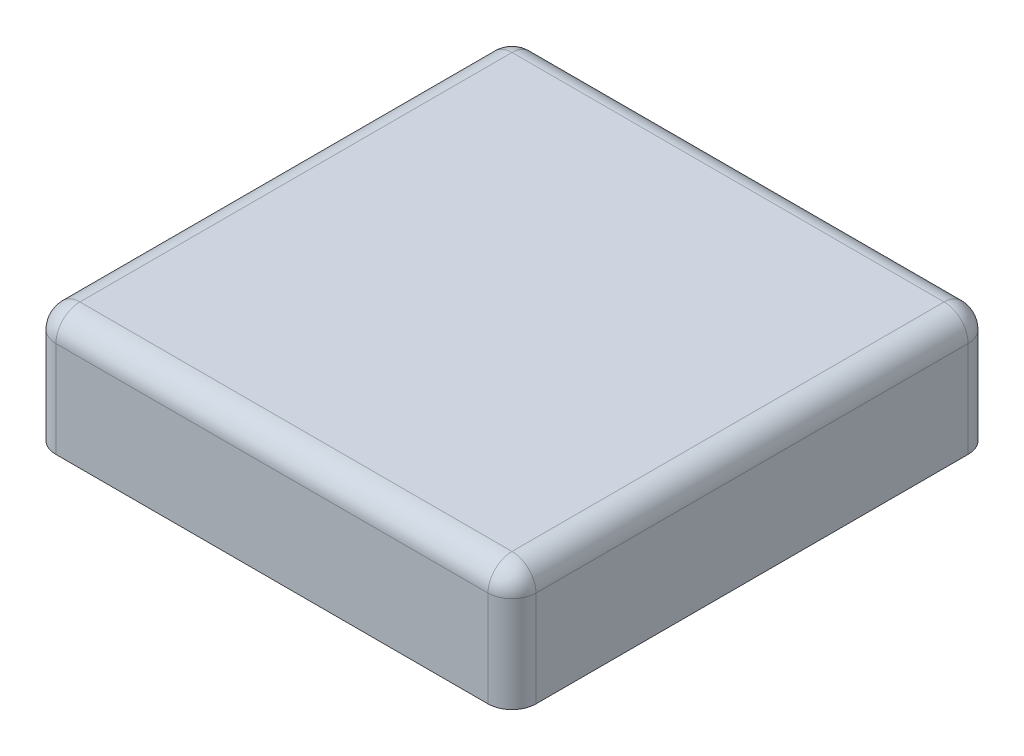
ISO-10303-21;
HEADER;
FILE_DESCRIPTION(('STEP AP214'),'2;1');
FILE_NAME('part.step','',(''),(''),'','','');
FILE_SCHEMA(('AUTOMOTIVE_DESIGN { 1 0 10303 214 1 1 1 1 }'));
ENDSEC;
DATA;
#1=APPLICATION_CONTEXT('core data for automotive mechanical design processes');
#2=APPLICATION_PROTOCOL_DEFINITION('international standard','automotive_design',2000,#1);
#3=PRODUCT_CONTEXT('',#1,'mechanical');
#4=PRODUCT('Part','Part','',(#3));
#5=PRODUCT_RELATED_PRODUCT_CATEGORY('part','',(#4));
#6=PRODUCT_DEFINITION_FORMATION('','',#4);
#7=PRODUCT_DEFINITION_CONTEXT('part definition',#1,'design');
#8=PRODUCT_DEFINITION('design','',#6,#7);
#9=PRODUCT_DEFINITION_SHAPE('','',#8);
#10=(LENGTH_UNIT() NAMED_UNIT(*) SI_UNIT(.MILLI.,.METRE.));
#11=(NAMED_UNIT(*) PLANE_ANGLE_UNIT() SI_UNIT($,.RADIAN.));
#12=(NAMED_UNIT(*) SI_UNIT($,.STERADIAN.) SOLID_ANGLE_UNIT());
#13=UNCERTAINTY_MEASURE_WITH_UNIT(LENGTH_MEASURE(1.E-05),#10,'distance_accuracy_value','');
#14=(GEOMETRIC_REPRESENTATION_CONTEXT(3) GLOBAL_UNCERTAINTY_ASSIGNED_CONTEXT((#13)) GLOBAL_UNIT_ASSIGNED_CONTEXT((#10,
#11,#12)) REPRESENTATION_CONTEXT('',''));
#15=CARTESIAN_POINT('',(0.,0.,0.));
#16=DIRECTION('',(0.,0.,1.));
#17=DIRECTION('',(1.,0.,0.));
#18=AXIS2_PLACEMENT_3D('',#15,#16,#17);
#19=CARTESIAN_POINT('',(0.,0.,0.));
#20=DIRECTION('',(0.,-1.,0.));
#21=DIRECTION('',(0.,0.,-1.));
#22=AXIS2_PLACEMENT_3D('',#19,#20,#21);
#23=PLANE('',#22);
#24=DIRECTION('',(-1.,0.,0.));
#25=VECTOR('',#24,1.);
#26=CARTESIAN_POINT('',(-3.00000000000002,0.,-3.00000000000002));
#27=LINE('',#26,#25);
#28=CARTESIAN_POINT('',(2.69999999999998,0.,-3.00000000000002));
#29=VERTEX_POINT('',#28);
#30=CARTESIAN_POINT('',(-2.70000000000002,0.,-3.00000000000002));
#31=VERTEX_POINT('',#30);
#32=EDGE_CURVE('E189',#29,#31,#27,.T.);
#33=ORIENTED_EDGE('',*,*,#32,.F.);
#34=CARTESIAN_POINT('',(2.69999999999998,0.,-2.70000000000002));
#35=DIRECTION('',(0.,-1.,0.));
#36=DIRECTION('',(0.,0.,-1.));
#37=AXIS2_PLACEMENT_3D('',#34,#35,#36);
#38=CIRCLE('',#37,0.3);
#39=CARTESIAN_POINT('',(2.99999999999998,0.,-2.70000000000002));
#40=VERTEX_POINT('',#39);
#41=EDGE_CURVE('E211',#29,#40,#38,.T.);
#42=ORIENTED_EDGE('',*,*,#41,.T.);
#43=DIRECTION('',(0.,0.,-1.));
#44=VECTOR('',#43,1.);
#45=CARTESIAN_POINT('',(2.99999999999998,0.,2.99999999999999));
#46=LINE('',#45,#44);
#47=CARTESIAN_POINT('',(2.99999999999998,0.,2.69999999999999));
#48=VERTEX_POINT('',#47);
#49=EDGE_CURVE('E186',#48,#40,#46,.T.);
#50=ORIENTED_EDGE('',*,*,#49,.F.);
#51=CARTESIAN_POINT('',(2.69999999999998,0.,2.69999999999999));
#52=DIRECTION('',(0.,-1.,0.));
#53=DIRECTION('',(0.,0.,-1.));
#54=AXIS2_PLACEMENT_3D('',#51,#52,#53);
#55=CIRCLE('',#54,0.3);
#56=CARTESIAN_POINT('',(2.69999999999998,0.,2.99999999999999));
#57=VERTEX_POINT('',#56);
#58=EDGE_CURVE('E209',#48,#57,#55,.T.);
#59=ORIENTED_EDGE('',*,*,#58,.T.);
#60=DIRECTION('',(1.,0.,0.));
#61=VECTOR('',#60,1.);
#62=CARTESIAN_POINT('',(-3.00000000000002,0.,2.99999999999999));
#63=LINE('',#62,#61);
#64=CARTESIAN_POINT('',(-2.70000000000002,0.,2.99999999999999));
#65=VERTEX_POINT('',#64);
#66=EDGE_CURVE('E195',#65,#57,#63,.T.);
#67=ORIENTED_EDGE('',*,*,#66,.F.);
#68=CARTESIAN_POINT('',(-2.70000000000002,0.,2.69999999999999));
#69=DIRECTION('',(0.,-1.,0.));
#70=DIRECTION('',(0.,0.,-1.));
#71=AXIS2_PLACEMENT_3D('',#68,#69,#70);
#72=CIRCLE('',#71,0.3);
#73=CARTESIAN_POINT('',(-3.00000000000002,0.,2.69999999999999));
#74=VERTEX_POINT('',#73);
#75=EDGE_CURVE('E205',#65,#74,#72,.T.);
#76=ORIENTED_EDGE('',*,*,#75,.T.);
#77=DIRECTION('',(0.,0.,1.));
#78=VECTOR('',#77,1.);
#79=CARTESIAN_POINT('',(-3.00000000000002,0.,2.99999999999999));
#80=LINE('',#79,#78);
#81=CARTESIAN_POINT('',(-3.00000000000002,0.,-2.70000000000002));
#82=VERTEX_POINT('',#81);
#83=EDGE_CURVE('E192',#82,#74,#80,.T.);
#84=ORIENTED_EDGE('',*,*,#83,.F.);
#85=CARTESIAN_POINT('',(-2.70000000000002,0.,-2.70000000000002));
#86=DIRECTION('',(0.,-1.,0.));
#87=DIRECTION('',(0.,0.,-1.));
#88=AXIS2_PLACEMENT_3D('',#85,#86,#87);
#89=CIRCLE('',#88,0.3);
#90=EDGE_CURVE('E207',#82,#31,#89,.T.);
#91=ORIENTED_EDGE('',*,*,#90,.T.);
#92=EDGE_LOOP('',(#33,#42,#50,#59,#67,#76,#84,#91));
#93=FACE_BOUND('',#92,.T.);
#94=DIRECTION('',(0.,0.,-1.));
#95=VECTOR('',#94,1.);
#96=CARTESIAN_POINT('',(2.69999999999998,0.,0.));
#97=LINE('',#96,#95);
#98=CARTESIAN_POINT('',(2.69999999999998,0.,2.69999999999999));
#99=VERTEX_POINT('',#98);
#100=CARTESIAN_POINT('',(2.69999999999998,0.,-2.70000000000002));
#101=VERTEX_POINT('',#100);
#102=EDGE_CURVE('E181',#99,#101,#97,.T.);
#103=ORIENTED_EDGE('',*,*,#102,.T.);
#104=DIRECTION('',(-1.,0.,0.));
#105=VECTOR('',#104,1.);
#106=CARTESIAN_POINT('',(0.,0.,-2.70000000000002));
#107=LINE('',#106,#105);
#108=CARTESIAN_POINT('',(-2.70000000000002,0.,-2.70000000000002));
#109=VERTEX_POINT('',#108);
#110=EDGE_CURVE('E162',#101,#109,#107,.T.);
#111=ORIENTED_EDGE('',*,*,#110,.T.);
#112=DIRECTION('',(0.,0.,1.));
#113=VECTOR('',#112,1.);
#114=CARTESIAN_POINT('',(-2.70000000000002,0.,0.));
#115=LINE('',#114,#113);
#116=CARTESIAN_POINT('',(-2.70000000000002,0.,2.69999999999999));
#117=VERTEX_POINT('',#116);
#118=EDGE_CURVE('E172',#109,#117,#115,.T.);
#119=ORIENTED_EDGE('',*,*,#118,.T.);
#120=DIRECTION('',(1.,0.,0.));
#121=VECTOR('',#120,1.);
#122=CARTESIAN_POINT('',(0.,0.,2.69999999999999));
#123=LINE('',#122,#121);
#124=EDGE_CURVE('E60',#117,#99,#123,.T.);
#125=ORIENTED_EDGE('',*,*,#124,.T.);
#126=EDGE_LOOP('',(#103,#111,#119,#125));
#127=FACE_BOUND('',#126,.T.);
#128=ADVANCED_FACE('F43',(#93,#127),#23,.T.);
#129=CARTESIAN_POINT('',(2.99999999999998,1.5,2.99999999999999));
#130=DIRECTION('',(-1.,0.,0.));
#131=DIRECTION('',(0.,0.,1.));
#132=AXIS2_PLACEMENT_3D('',#129,#130,#131);
#133=PLANE('',#132);
#134=ORIENTED_EDGE('',*,*,#49,.T.);
#135=DIRECTION('',(0.,-1.,0.));
#136=VECTOR('',#135,1.);
#137=CARTESIAN_POINT('',(2.99999999999998,1.5,-2.70000000000002));
#138=LINE('',#137,#136);
#139=CARTESIAN_POINT('',(2.99999999999998,1.2,-2.70000000000002));
#140=VERTEX_POINT('',#139);
#141=EDGE_CURVE('E217',#40,#140,#138,.F.);
#142=ORIENTED_EDGE('',*,*,#141,.T.);
#143=DIRECTION('',(0.,0.,-1.));
#144=VECTOR('',#143,1.);
#145=CARTESIAN_POINT('',(2.99999999999998,1.2,2.99999999999999));
#146=LINE('',#145,#144);
#147=CARTESIAN_POINT('',(2.99999999999998,1.2,2.69999999999999));
#148=VERTEX_POINT('',#147);
#149=EDGE_CURVE('E213',#140,#148,#146,.F.);
#150=ORIENTED_EDGE('',*,*,#149,.T.);
#151=DIRECTION('',(0.,-1.,0.));
#152=VECTOR('',#151,1.);
#153=CARTESIAN_POINT('',(2.99999999999998,1.5,2.69999999999999));
#154=LINE('',#153,#152);
#155=EDGE_CURVE('E215',#148,#48,#154,.T.);
#156=ORIENTED_EDGE('',*,*,#155,.T.);
#157=EDGE_LOOP('',(#134,#142,#150,#156));
#158=FACE_BOUND('',#157,.T.);
#159=ADVANCED_FACE('F323',(#158),#133,.F.);
#160=CARTESIAN_POINT('',(-3.00000000000002,1.5,-3.00000000000002));
#161=DIRECTION('',(0.,0.,1.));
#162=DIRECTION('',(1.,0.,0.));
#163=AXIS2_PLACEMENT_3D('',#160,#161,#162);
#164=PLANE('',#163);
#165=DIRECTION('',(-1.,0.,0.));
#166=VECTOR('',#165,1.);
#167=CARTESIAN_POINT('',(-3.00000000000002,1.2,-3.00000000000002));
#168=LINE('',#167,#166);
#169=CARTESIAN_POINT('',(-2.70000000000002,1.2,-3.00000000000002));
#170=VERTEX_POINT('',#169);
#171=CARTESIAN_POINT('',(2.69999999999998,1.2,-3.00000000000002));
#172=VERTEX_POINT('',#171);
#173=EDGE_CURVE('E198',#170,#172,#168,.F.);
#174=ORIENTED_EDGE('',*,*,#173,.T.);
#175=DIRECTION('',(0.,-1.,0.));
#176=VECTOR('',#175,1.);
#177=CARTESIAN_POINT('',(2.69999999999998,1.5,-3.00000000000002));
#178=LINE('',#177,#176);
#179=EDGE_CURVE('E202',#172,#29,#178,.T.);
#180=ORIENTED_EDGE('',*,*,#179,.T.);
#181=ORIENTED_EDGE('',*,*,#32,.T.);
#182=DIRECTION('',(0.,-1.,0.));
#183=VECTOR('',#182,1.);
#184=CARTESIAN_POINT('',(-2.70000000000002,1.5,-3.00000000000002));
#185=LINE('',#184,#183);
#186=EDGE_CURVE('E200',#31,#170,#185,.F.);
#187=ORIENTED_EDGE('',*,*,#186,.T.);
#188=EDGE_LOOP('',(#174,#180,#181,#187));
#189=FACE_BOUND('',#188,.T.);
#190=ADVANCED_FACE('F314',(#189),#164,.F.);
#191=CARTESIAN_POINT('',(-3.00000000000002,1.5,2.99999999999999));
#192=DIRECTION('',(1.,0.,0.));
#193=DIRECTION('',(0.,0.,-1.));
#194=AXIS2_PLACEMENT_3D('',#191,#192,#193);
#195=PLANE('',#194);
#196=DIRECTION('',(0.,0.,1.));
#197=VECTOR('',#196,1.);
#198=CARTESIAN_POINT('',(-3.00000000000002,1.2,2.99999999999999));
#199=LINE('',#198,#197);
#200=CARTESIAN_POINT('',(-3.00000000000002,1.2,2.69999999999999));
#201=VERTEX_POINT('',#200);
#202=CARTESIAN_POINT('',(-3.00000000000002,1.2,-2.70000000000002));
#203=VERTEX_POINT('',#202);
#204=EDGE_CURVE('E225',#201,#203,#199,.F.);
#205=ORIENTED_EDGE('',*,*,#204,.T.);
#206=DIRECTION('',(0.,-1.,0.));
#207=VECTOR('',#206,1.);
#208=CARTESIAN_POINT('',(-3.00000000000002,1.5,-2.70000000000002));
#209=LINE('',#208,#207);
#210=EDGE_CURVE('E229',#203,#82,#209,.T.);
#211=ORIENTED_EDGE('',*,*,#210,.T.);
#212=ORIENTED_EDGE('',*,*,#83,.T.);
#213=DIRECTION('',(0.,-1.,0.));
#214=VECTOR('',#213,1.);
#215=CARTESIAN_POINT('',(-3.00000000000002,1.5,2.69999999999999));
#216=LINE('',#215,#214);
#217=EDGE_CURVE('E227',#74,#201,#216,.F.);
#218=ORIENTED_EDGE('',*,*,#217,.T.);
#219=EDGE_LOOP('',(#205,#211,#212,#218));
#220=FACE_BOUND('',#219,.T.);
#221=ADVANCED_FACE('F306',(#220),#195,.F.);
#222=CARTESIAN_POINT('',(-3.00000000000002,1.5,2.99999999999999));
#223=DIRECTION('',(0.,0.,-1.));
#224=DIRECTION('',(-1.,0.,0.));
#225=AXIS2_PLACEMENT_3D('',#222,#223,#224);
#226=PLANE('',#225);
#227=ORIENTED_EDGE('',*,*,#66,.T.);
#228=DIRECTION('',(0.,-1.,0.));
#229=VECTOR('',#228,1.);
#230=CARTESIAN_POINT('',(2.69999999999998,1.5,2.99999999999999));
#231=LINE('',#230,#229);
#232=CARTESIAN_POINT('',(2.69999999999998,1.2,2.99999999999999));
#233=VERTEX_POINT('',#232);
#234=EDGE_CURVE('E223',#57,#233,#231,.F.);
#235=ORIENTED_EDGE('',*,*,#234,.T.);
#236=DIRECTION('',(1.,0.,0.));
#237=VECTOR('',#236,1.);
#238=CARTESIAN_POINT('',(-3.00000000000002,1.2,2.99999999999999));
#239=LINE('',#238,#237);
#240=CARTESIAN_POINT('',(-2.70000000000002,1.2,2.99999999999999));
#241=VERTEX_POINT('',#240);
#242=EDGE_CURVE('E219',#233,#241,#239,.F.);
#243=ORIENTED_EDGE('',*,*,#242,.T.);
#244=DIRECTION('',(0.,-1.,0.));
#245=VECTOR('',#244,1.);
#246=CARTESIAN_POINT('',(-2.70000000000002,1.5,2.99999999999999));
#247=LINE('',#246,#245);
#248=EDGE_CURVE('E221',#241,#65,#247,.T.);
#249=ORIENTED_EDGE('',*,*,#248,.T.);
#250=EDGE_LOOP('',(#227,#235,#243,#249));
#251=FACE_BOUND('',#250,.T.);
#252=ADVANCED_FACE('F282',(#251),#226,.F.);
#253=CARTESIAN_POINT('',(0.,1.5,0.));
#254=DIRECTION('',(0.,-1.,0.));
#255=DIRECTION('',(0.,0.,-1.));
#256=AXIS2_PLACEMENT_3D('',#253,#254,#255);
#257=PLANE('',#256);
#258=DIRECTION('',(1.,0.,0.));
#259=VECTOR('',#258,1.);
#260=CARTESIAN_POINT('',(0.,1.5,2.69999999999999));
#261=LINE('',#260,#259);
#262=CARTESIAN_POINT('',(-2.70000000000002,1.5,2.69999999999999));
#263=VERTEX_POINT('',#262);
#264=CARTESIAN_POINT('',(2.69999999999998,1.5,2.69999999999999));
#265=VERTEX_POINT('',#264);
#266=EDGE_CURVE('E52',#263,#265,#261,.T.);
#267=ORIENTED_EDGE('',*,*,#266,.T.);
#268=DIRECTION('',(0.,0.,-1.));
#269=VECTOR('',#268,1.);
#270=CARTESIAN_POINT('',(2.69999999999998,1.5,0.));
#271=LINE('',#270,#269);
#272=CARTESIAN_POINT('',(2.69999999999998,1.5,-2.70000000000002));
#273=VERTEX_POINT('',#272);
#274=EDGE_CURVE('E11',#265,#273,#271,.T.);
#275=ORIENTED_EDGE('',*,*,#274,.T.);
#276=DIRECTION('',(-1.,0.,0.));
#277=VECTOR('',#276,1.);
#278=CARTESIAN_POINT('',(0.,1.5,-2.70000000000002));
#279=LINE('',#278,#277);
#280=CARTESIAN_POINT('',(-2.70000000000002,1.5,-2.70000000000002));
#281=VERTEX_POINT('',#280);
#282=EDGE_CURVE('E233',#273,#281,#279,.T.);
#283=ORIENTED_EDGE('',*,*,#282,.T.);
#284=DIRECTION('',(0.,0.,1.));
#285=VECTOR('',#284,1.);
#286=CARTESIAN_POINT('',(-2.70000000000002,1.5,0.));
#287=LINE('',#286,#285);
#288=EDGE_CURVE('E231',#281,#263,#287,.T.);
#289=ORIENTED_EDGE('',*,*,#288,.T.);
#290=EDGE_LOOP('',(#267,#275,#283,#289));
#291=FACE_BOUND('',#290,.T.);
#292=ADVANCED_FACE('F298',(#291),#257,.F.);
#293=CARTESIAN_POINT('',(-2.70000000000002,1.5,2.69999999999999));
#294=DIRECTION('',(0.,-1.,0.));
#295=DIRECTION('',(0.,0.,-1.));
#296=AXIS2_PLACEMENT_3D('',#293,#294,#295);
#297=CYLINDRICAL_SURFACE('',#296,0.3);
#298=CARTESIAN_POINT('',(-2.70000000000002,1.2,2.69999999999999));
#299=DIRECTION('',(0.,1.,0.));
#300=DIRECTION('',(0.,0.,1.));
#301=AXIS2_PLACEMENT_3D('',#298,#299,#300);
#302=CIRCLE('',#301,0.3);
#303=EDGE_CURVE('E47',#201,#241,#302,.T.);
#304=ORIENTED_EDGE('',*,*,#303,.F.);
#305=ORIENTED_EDGE('',*,*,#217,.F.);
#306=ORIENTED_EDGE('',*,*,#75,.F.);
#307=ORIENTED_EDGE('',*,*,#248,.F.);
#308=EDGE_LOOP('',(#304,#305,#306,#307));
#309=FACE_BOUND('',#308,.T.);
#310=ADVANCED_FACE('F45',(#309),#297,.T.);
#311=CARTESIAN_POINT('',(-2.70000000000002,1.2,2.69999999999999));
#312=DIRECTION('',(0.,0.,1.));
#313=DIRECTION('',(1.,0.,0.));
#314=AXIS2_PLACEMENT_3D('',#311,#312,#313);
#315=SPHERICAL_SURFACE('',#314,0.3);
#316=CARTESIAN_POINT('',(-2.70000000000002,1.2,2.69999999999999));
#317=DIRECTION('',(0.,0.,1.));
#318=DIRECTION('',(1.,0.,0.));
#319=AXIS2_PLACEMENT_3D('',#316,#317,#318);
#320=CIRCLE('',#319,0.3);
#321=EDGE_CURVE('E262',#201,#263,#320,.F.);
#322=ORIENTED_EDGE('',*,*,#321,.F.);
#323=ORIENTED_EDGE('',*,*,#303,.T.);
#324=CARTESIAN_POINT('',(-2.70000000000002,1.2,2.69999999999999));
#325=DIRECTION('',(-1.,0.,0.));
#326=DIRECTION('',(0.,0.,1.));
#327=AXIS2_PLACEMENT_3D('',#324,#325,#326);
#328=CIRCLE('',#327,0.3);
#329=EDGE_CURVE('E264',#263,#241,#328,.F.);
#330=ORIENTED_EDGE('',*,*,#329,.F.);
#331=EDGE_LOOP('',(#322,#323,#330));
#332=FACE_BOUND('',#331,.T.);
#333=ADVANCED_FACE('F274',(#332),#315,.T.);
#334=CARTESIAN_POINT('',(2.69999999999998,1.5,2.69999999999999));
#335=DIRECTION('',(0.,-1.,0.));
#336=DIRECTION('',(0.,0.,-1.));
#337=AXIS2_PLACEMENT_3D('',#334,#335,#336);
#338=CYLINDRICAL_SURFACE('',#337,0.3);
#339=ORIENTED_EDGE('',*,*,#58,.F.);
#340=ORIENTED_EDGE('',*,*,#155,.F.);
#341=CARTESIAN_POINT('',(2.69999999999998,1.2,2.69999999999999));
#342=DIRECTION('',(0.,1.,0.));
#343=DIRECTION('',(0.,0.,1.));
#344=AXIS2_PLACEMENT_3D('',#341,#342,#343);
#345=CIRCLE('',#344,0.3);
#346=EDGE_CURVE('E259',#233,#148,#345,.T.);
#347=ORIENTED_EDGE('',*,*,#346,.F.);
#348=ORIENTED_EDGE('',*,*,#234,.F.);
#349=EDGE_LOOP('',(#339,#340,#347,#348));
#350=FACE_BOUND('',#349,.T.);
#351=ADVANCED_FACE('F292',(#350),#338,.T.);
#352=CARTESIAN_POINT('',(0.,1.2,2.69999999999999));
#353=DIRECTION('',(1.,0.,0.));
#354=DIRECTION('',(0.,0.,-1.));
#355=AXIS2_PLACEMENT_3D('',#352,#353,#354);
#356=CYLINDRICAL_SURFACE('',#355,0.3);
#357=ORIENTED_EDGE('',*,*,#329,.T.);
#358=ORIENTED_EDGE('',*,*,#242,.F.);
#359=CARTESIAN_POINT('',(2.69999999999998,1.2,2.69999999999999));
#360=DIRECTION('',(1.,0.,0.));
#361=DIRECTION('',(0.,0.,-1.));
#362=AXIS2_PLACEMENT_3D('',#359,#360,#361);
#363=CIRCLE('',#362,0.3);
#364=EDGE_CURVE('E256',#265,#233,#363,.T.);
#365=ORIENTED_EDGE('',*,*,#364,.F.);
#366=ORIENTED_EDGE('',*,*,#266,.F.);
#367=EDGE_LOOP('',(#357,#358,#365,#366));
#368=FACE_BOUND('',#367,.T.);
#369=ADVANCED_FACE('F295',(#368),#356,.T.);
#370=CARTESIAN_POINT('',(-2.70000000000002,1.2,0.));
#371=DIRECTION('',(0.,0.,1.));
#372=DIRECTION('',(1.,0.,0.));
#373=AXIS2_PLACEMENT_3D('',#370,#371,#372);
#374=CYLINDRICAL_SURFACE('',#373,0.3);
#375=ORIENTED_EDGE('',*,*,#321,.T.);
#376=ORIENTED_EDGE('',*,*,#288,.F.);
#377=CARTESIAN_POINT('',(-2.70000000000002,1.2,-2.70000000000002));
#378=DIRECTION('',(0.,0.,-1.));
#379=DIRECTION('',(-1.,0.,0.));
#380=AXIS2_PLACEMENT_3D('',#377,#378,#379);
#381=CIRCLE('',#380,0.3);
#382=EDGE_CURVE('E253',#203,#281,#381,.T.);
#383=ORIENTED_EDGE('',*,*,#382,.F.);
#384=ORIENTED_EDGE('',*,*,#204,.F.);
#385=EDGE_LOOP('',(#375,#376,#383,#384));
#386=FACE_BOUND('',#385,.T.);
#387=ADVANCED_FACE('F303',(#386),#374,.T.);
#388=CARTESIAN_POINT('',(-2.70000000000002,1.5,-2.70000000000002));
#389=DIRECTION('',(0.,-1.,0.));
#390=DIRECTION('',(0.,0.,-1.));
#391=AXIS2_PLACEMENT_3D('',#388,#389,#390);
#392=CYLINDRICAL_SURFACE('',#391,0.3);
#393=ORIENTED_EDGE('',*,*,#90,.F.);
#394=ORIENTED_EDGE('',*,*,#210,.F.);
#395=CARTESIAN_POINT('',(-2.70000000000002,1.2,-2.70000000000002));
#396=DIRECTION('',(0.,1.,0.));
#397=DIRECTION('',(0.,0.,1.));
#398=AXIS2_PLACEMENT_3D('',#395,#396,#397);
#399=CIRCLE('',#398,0.3);
#400=EDGE_CURVE('E250',#170,#203,#399,.T.);
#401=ORIENTED_EDGE('',*,*,#400,.F.);
#402=ORIENTED_EDGE('',*,*,#186,.F.);
#403=EDGE_LOOP('',(#393,#394,#401,#402));
#404=FACE_BOUND('',#403,.T.);
#405=ADVANCED_FACE('F310',(#404),#392,.T.);
#406=CARTESIAN_POINT('',(2.69999999999998,1.2,2.69999999999999));
#407=DIRECTION('',(0.,0.,1.));
#408=DIRECTION('',(1.,0.,0.));
#409=AXIS2_PLACEMENT_3D('',#406,#407,#408);
#410=SPHERICAL_SURFACE('',#409,0.3);
#411=ORIENTED_EDGE('',*,*,#364,.T.);
#412=ORIENTED_EDGE('',*,*,#346,.T.);
#413=CARTESIAN_POINT('',(2.69999999999998,1.2,2.69999999999999));
#414=DIRECTION('',(0.,0.,1.));
#415=DIRECTION('',(1.,0.,0.));
#416=AXIS2_PLACEMENT_3D('',#413,#414,#415);
#417=CIRCLE('',#416,0.3);
#418=EDGE_CURVE('E248',#265,#148,#417,.F.);
#419=ORIENTED_EDGE('',*,*,#418,.F.);
#420=EDGE_LOOP('',(#411,#412,#419));
#421=FACE_BOUND('',#420,.T.);
#422=ADVANCED_FACE('F333',(#421),#410,.T.);
#423=CARTESIAN_POINT('',(-2.70000000000002,1.2,-2.70000000000002));
#424=DIRECTION('',(-1.,0.,0.));
#425=DIRECTION('',(0.,0.,1.));
#426=AXIS2_PLACEMENT_3D('',#423,#424,#425);
#427=SPHERICAL_SURFACE('',#426,0.3);
#428=ORIENTED_EDGE('',*,*,#400,.T.);
#429=ORIENTED_EDGE('',*,*,#382,.T.);
#430=CARTESIAN_POINT('',(-2.70000000000002,1.2,-2.70000000000002));
#431=DIRECTION('',(-1.,0.,0.));
#432=DIRECTION('',(0.,0.,1.));
#433=AXIS2_PLACEMENT_3D('',#430,#431,#432);
#434=CIRCLE('',#433,0.3);
#435=EDGE_CURVE('E245',#170,#281,#434,.F.);
#436=ORIENTED_EDGE('',*,*,#435,.F.);
#437=EDGE_LOOP('',(#428,#429,#436));
#438=FACE_BOUND('',#437,.T.);
#439=ADVANCED_FACE('F331',(#438),#427,.T.);
#440=CARTESIAN_POINT('',(2.69999999999998,1.2,0.));
#441=DIRECTION('',(0.,0.,-1.));
#442=DIRECTION('',(-1.,0.,0.));
#443=AXIS2_PLACEMENT_3D('',#440,#441,#442);
#444=CYLINDRICAL_SURFACE('',#443,0.3);
#445=ORIENTED_EDGE('',*,*,#418,.T.);
#446=ORIENTED_EDGE('',*,*,#149,.F.);
#447=CARTESIAN_POINT('',(2.69999999999998,1.2,-2.70000000000002));
#448=DIRECTION('',(0.,0.,-1.));
#449=DIRECTION('',(-1.,0.,0.));
#450=AXIS2_PLACEMENT_3D('',#447,#448,#449);
#451=CIRCLE('',#450,0.3);
#452=EDGE_CURVE('E242',#273,#140,#451,.T.);
#453=ORIENTED_EDGE('',*,*,#452,.F.);
#454=ORIENTED_EDGE('',*,*,#274,.F.);
#455=EDGE_LOOP('',(#445,#446,#453,#454));
#456=FACE_BOUND('',#455,.T.);
#457=ADVANCED_FACE('F325',(#456),#444,.T.);
#458=CARTESIAN_POINT('',(0.,1.2,-2.70000000000002));
#459=DIRECTION('',(-1.,0.,0.));
#460=DIRECTION('',(0.,0.,1.));
#461=AXIS2_PLACEMENT_3D('',#458,#459,#460);
#462=CYLINDRICAL_SURFACE('',#461,0.3);
#463=ORIENTED_EDGE('',*,*,#435,.T.);
#464=ORIENTED_EDGE('',*,*,#282,.F.);
#465=CARTESIAN_POINT('',(2.69999999999998,1.2,-2.70000000000002));
#466=DIRECTION('',(1.,0.,0.));
#467=DIRECTION('',(0.,0.,-1.));
#468=AXIS2_PLACEMENT_3D('',#465,#466,#467);
#469=CIRCLE('',#468,0.3);
#470=EDGE_CURVE('E239',#172,#273,#469,.T.);
#471=ORIENTED_EDGE('',*,*,#470,.F.);
#472=ORIENTED_EDGE('',*,*,#173,.F.);
#473=EDGE_LOOP('',(#463,#464,#471,#472));
#474=FACE_BOUND('',#473,.T.);
#475=ADVANCED_FACE('F329',(#474),#462,.T.);
#476=CARTESIAN_POINT('',(2.69999999999998,1.2,-2.70000000000002));
#477=DIRECTION('',(0.,1.,0.));
#478=DIRECTION('',(0.,0.,1.));
#479=AXIS2_PLACEMENT_3D('',#476,#477,#478);
#480=SPHERICAL_SURFACE('',#479,0.3);
#481=ORIENTED_EDGE('',*,*,#470,.T.);
#482=ORIENTED_EDGE('',*,*,#452,.T.);
#483=CARTESIAN_POINT('',(2.69999999999998,1.2,-2.70000000000002));
#484=DIRECTION('',(0.,1.,0.));
#485=DIRECTION('',(0.,0.,1.));
#486=AXIS2_PLACEMENT_3D('',#483,#484,#485);
#487=CIRCLE('',#486,0.3);
#488=EDGE_CURVE('E156',#172,#140,#487,.F.);
#489=ORIENTED_EDGE('',*,*,#488,.F.);
#490=EDGE_LOOP('',(#481,#482,#489));
#491=FACE_BOUND('',#490,.T.);
#492=ADVANCED_FACE('F327',(#491),#480,.T.);
#493=CARTESIAN_POINT('',(2.69999999999998,1.5,-2.70000000000002));
#494=DIRECTION('',(0.,-1.,0.));
#495=DIRECTION('',(0.,0.,-1.));
#496=AXIS2_PLACEMENT_3D('',#493,#494,#495);
#497=CYLINDRICAL_SURFACE('',#496,0.3);
#498=ORIENTED_EDGE('',*,*,#488,.T.);
#499=ORIENTED_EDGE('',*,*,#141,.F.);
#500=ORIENTED_EDGE('',*,*,#41,.F.);
#501=ORIENTED_EDGE('',*,*,#179,.F.);
#502=EDGE_LOOP('',(#498,#499,#500,#501));
#503=FACE_BOUND('',#502,.T.);
#504=ADVANCED_FACE('F319',(#503),#497,.T.);
#505=CARTESIAN_POINT('',(2.69999999999998,1.5,2.99999999999999));
#506=DIRECTION('',(-1.,0.,0.));
#507=DIRECTION('',(0.,0.,1.));
#508=AXIS2_PLACEMENT_3D('',#505,#506,#507);
#509=PLANE('',#508);
#510=ORIENTED_EDGE('',*,*,#102,.F.);
#511=DIRECTION('',(0.,-1.,0.));
#512=VECTOR('',#511,1.);
#513=CARTESIAN_POINT('',(2.69999999999998,1.5,2.69999999999999));
#514=LINE('',#513,#512);
#515=CARTESIAN_POINT('',(2.69999999999998,1.2,2.69999999999999));
#516=VERTEX_POINT('',#515);
#517=EDGE_CURVE('E167',#516,#99,#514,.T.);
#518=ORIENTED_EDGE('',*,*,#517,.F.);
#519=DIRECTION('',(0.,0.,1.));
#520=VECTOR('',#519,1.);
#521=CARTESIAN_POINT('',(2.69999999999998,1.2,2.99999999999999));
#522=LINE('',#521,#520);
#523=CARTESIAN_POINT('',(2.69999999999998,1.2,-2.70000000000002));
#524=VERTEX_POINT('',#523);
#525=EDGE_CURVE('E152',#524,#516,#522,.T.);
#526=ORIENTED_EDGE('',*,*,#525,.F.);
#527=DIRECTION('',(0.,1.,0.));
#528=VECTOR('',#527,1.);
#529=CARTESIAN_POINT('',(2.69999999999998,1.5,-2.70000000000002));
#530=LINE('',#529,#528);
#531=EDGE_CURVE('E159',#101,#524,#530,.T.);
#532=ORIENTED_EDGE('',*,*,#531,.F.);
#533=EDGE_LOOP('',(#510,#518,#526,#532));
#534=FACE_BOUND('',#533,.T.);
#535=ADVANCED_FACE('F169',(#534),#509,.T.);
#536=CARTESIAN_POINT('',(-3.00000000000002,1.5,-2.70000000000002));
#537=DIRECTION('',(0.,0.,1.));
#538=DIRECTION('',(1.,0.,0.));
#539=AXIS2_PLACEMENT_3D('',#536,#537,#538);
#540=PLANE('',#539);
#541=DIRECTION('',(-1.,0.,0.));
#542=VECTOR('',#541,1.);
#543=CARTESIAN_POINT('',(0.,1.2,-2.70000000000002));
#544=LINE('',#543,#542);
#545=CARTESIAN_POINT('',(-2.70000000000002,1.2,-2.70000000000002));
#546=VERTEX_POINT('',#545);
#547=EDGE_CURVE('E147',#524,#546,#544,.T.);
#548=ORIENTED_EDGE('',*,*,#547,.T.);
#549=DIRECTION('',(0.,-1.,0.));
#550=VECTOR('',#549,1.);
#551=CARTESIAN_POINT('',(-2.70000000000002,1.5,-2.70000000000002));
#552=LINE('',#551,#550);
#553=EDGE_CURVE('E175',#546,#109,#552,.T.);
#554=ORIENTED_EDGE('',*,*,#553,.T.);
#555=ORIENTED_EDGE('',*,*,#110,.F.);
#556=ORIENTED_EDGE('',*,*,#531,.T.);
#557=EDGE_LOOP('',(#548,#554,#555,#556));
#558=FACE_BOUND('',#557,.T.);
#559=ADVANCED_FACE('F160',(#558),#540,.T.);
#560=CARTESIAN_POINT('',(-2.70000000000002,1.5,2.99999999999999));
#561=DIRECTION('',(1.,0.,0.));
#562=DIRECTION('',(0.,0.,-1.));
#563=AXIS2_PLACEMENT_3D('',#560,#561,#562);
#564=PLANE('',#563);
#565=DIRECTION('',(0.,0.,1.));
#566=VECTOR('',#565,1.);
#567=CARTESIAN_POINT('',(-2.70000000000002,1.2,0.));
#568=LINE('',#567,#566);
#569=CARTESIAN_POINT('',(-2.70000000000002,1.2,2.69999999999999));
#570=VERTEX_POINT('',#569);
#571=EDGE_CURVE('E154',#546,#570,#568,.T.);
#572=ORIENTED_EDGE('',*,*,#571,.T.);
#573=DIRECTION('',(0.,1.,0.));
#574=VECTOR('',#573,1.);
#575=CARTESIAN_POINT('',(-2.70000000000002,1.5,2.69999999999999));
#576=LINE('',#575,#574);
#577=EDGE_CURVE('E177',#117,#570,#576,.T.);
#578=ORIENTED_EDGE('',*,*,#577,.F.);
#579=ORIENTED_EDGE('',*,*,#118,.F.);
#580=ORIENTED_EDGE('',*,*,#553,.F.);
#581=EDGE_LOOP('',(#572,#578,#579,#580));
#582=FACE_BOUND('',#581,.T.);
#583=ADVANCED_FACE('F385',(#582),#564,.T.);
#584=CARTESIAN_POINT('',(-3.00000000000002,1.5,2.69999999999999));
#585=DIRECTION('',(0.,0.,-1.));
#586=DIRECTION('',(-1.,0.,0.));
#587=AXIS2_PLACEMENT_3D('',#584,#585,#586);
#588=PLANE('',#587);
#589=ORIENTED_EDGE('',*,*,#124,.F.);
#590=ORIENTED_EDGE('',*,*,#577,.T.);
#591=DIRECTION('',(-1.,0.,0.));
#592=VECTOR('',#591,1.);
#593=CARTESIAN_POINT('',(-3.00000000000002,1.2,2.69999999999999));
#594=LINE('',#593,#592);
#595=EDGE_CURVE('E166',#516,#570,#594,.T.);
#596=ORIENTED_EDGE('',*,*,#595,.F.);
#597=ORIENTED_EDGE('',*,*,#517,.T.);
#598=EDGE_LOOP('',(#589,#590,#596,#597));
#599=FACE_BOUND('',#598,.T.);
#600=ADVANCED_FACE('F392',(#599),#588,.T.);
#601=CARTESIAN_POINT('',(0.,1.2,0.));
#602=DIRECTION('',(0.,-1.,0.));
#603=DIRECTION('',(0.,0.,-1.));
#604=AXIS2_PLACEMENT_3D('',#601,#602,#603);
#605=PLANE('',#604);
#606=ORIENTED_EDGE('',*,*,#595,.T.);
#607=ORIENTED_EDGE('',*,*,#571,.F.);
#608=ORIENTED_EDGE('',*,*,#547,.F.);
#609=ORIENTED_EDGE('',*,*,#525,.T.);
#610=EDGE_LOOP('',(#606,#607,#608,#609));
#611=FACE_BOUND('',#610,.T.);
#612=ADVANCED_FACE('F150',(#611),#605,.T.);
#613=CLOSED_SHELL('',(#128,#159,#190,#221,#252,#292,#310,#333,#351,#369,#387,#405,#422,#439,
#457,#475,#492,#504,#535,#559,#583,#600,#612));
#614=MANIFOLD_SOLID_BREP('B2',#613);
#615=ADVANCED_BREP_SHAPE_REPRESENTATION('',(#18,#614),#14);
#616=SHAPE_DEFINITION_REPRESENTATION(#9,#615);
ENDSEC;
END-ISO-10303-21;
